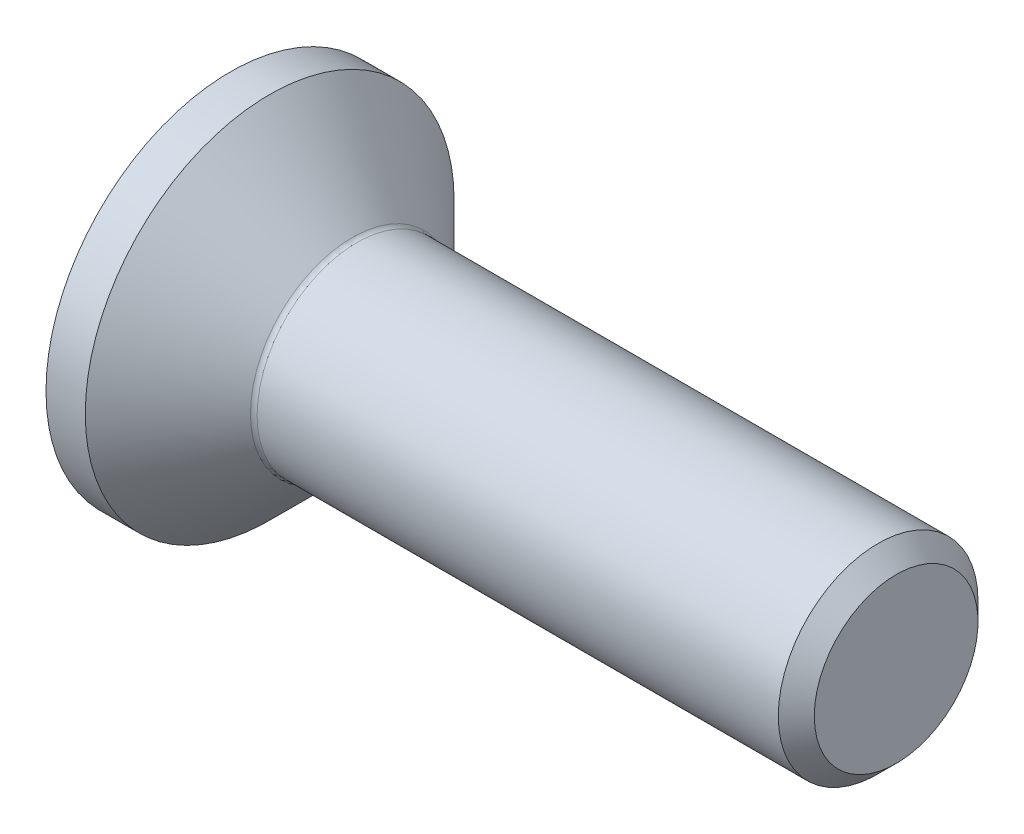
ISO-10303-21;
HEADER;
FILE_DESCRIPTION(('STEP AP214'),'2;1');
FILE_NAME('part.step','',(''),(''),'','','');
FILE_SCHEMA(('AUTOMOTIVE_DESIGN { 1 0 10303 214 1 1 1 1 }'));
ENDSEC;
DATA;
#1=APPLICATION_CONTEXT('core data for automotive mechanical design processes');
#2=APPLICATION_PROTOCOL_DEFINITION('international standard','automotive_design',2000,#1);
#3=PRODUCT_CONTEXT('',#1,'mechanical');
#4=PRODUCT('Part','Part','',(#3));
#5=PRODUCT_RELATED_PRODUCT_CATEGORY('part','',(#4));
#6=PRODUCT_DEFINITION_FORMATION('','',#4);
#7=PRODUCT_DEFINITION_CONTEXT('part definition',#1,'design');
#8=PRODUCT_DEFINITION('design','',#6,#7);
#9=PRODUCT_DEFINITION_SHAPE('','',#8);
#10=(LENGTH_UNIT() NAMED_UNIT(*) SI_UNIT(.MILLI.,.METRE.));
#11=(NAMED_UNIT(*) PLANE_ANGLE_UNIT() SI_UNIT($,.RADIAN.));
#12=(NAMED_UNIT(*) SI_UNIT($,.STERADIAN.) SOLID_ANGLE_UNIT());
#13=UNCERTAINTY_MEASURE_WITH_UNIT(LENGTH_MEASURE(1.E-05),#10,'distance_accuracy_value','');
#14=(GEOMETRIC_REPRESENTATION_CONTEXT(3) GLOBAL_UNCERTAINTY_ASSIGNED_CONTEXT((#13)) GLOBAL_UNIT_ASSIGNED_CONTEXT((#10,
#11,#12)) REPRESENTATION_CONTEXT('',''));
#15=CARTESIAN_POINT('',(0.,0.,0.));
#16=DIRECTION('',(0.,0.,1.));
#17=DIRECTION('',(1.,0.,0.));
#18=AXIS2_PLACEMENT_3D('',#15,#16,#17);
#19=CARTESIAN_POINT('',(10.,1.5,0.));
#20=DIRECTION('',(-1.,0.,0.));
#21=DIRECTION('',(0.,0.,1.));
#22=AXIS2_PLACEMENT_3D('',#19,#20,#21);
#23=PLANE('',#22);
#24=CARTESIAN_POINT('',(10.,0.,0.));
#25=DIRECTION('',(-1.,0.,0.));
#26=DIRECTION('',(0.,0.,1.));
#27=AXIS2_PLACEMENT_3D('',#24,#25,#26);
#28=CIRCLE('',#27,1.22949999999999);
#29=CARTESIAN_POINT('',(10.,0.,1.22949999999999));
#30=VERTEX_POINT('',#29);
#31=EDGE_CURVE('E11',#30,#30,#28,.F.);
#32=ORIENTED_EDGE('',*,*,#31,.T.);
#33=EDGE_LOOP('',(#32));
#34=FACE_BOUND('',#33,.T.);
#35=ADVANCED_FACE('F40',(#34),#23,.F.);
#36=CARTESIAN_POINT('',(-0.587069180985524,0.,0.));
#37=DIRECTION('',(-1.,0.,0.));
#38=DIRECTION('',(0.,0.,1.));
#39=AXIS2_PLACEMENT_3D('',#36,#37,#38);
#40=CYLINDRICAL_SURFACE('',#39,1.5);
#41=CARTESIAN_POINT('',(9.7295,0.,0.));
#42=DIRECTION('',(-1.,0.,0.));
#43=DIRECTION('',(0.,0.,1.));
#44=AXIS2_PLACEMENT_3D('',#41,#42,#43);
#45=CIRCLE('',#44,1.5);
#46=CARTESIAN_POINT('',(9.7295,0.,1.5));
#47=VERTEX_POINT('',#46);
#48=EDGE_CURVE('E49',#47,#47,#45,.T.);
#49=ORIENTED_EDGE('',*,*,#48,.T.);
#50=EDGE_LOOP('',(#49));
#51=FACE_BOUND('',#50,.T.);
#52=CARTESIAN_POINT('',(1.90142135623731,0.,0.));
#53=DIRECTION('',(-1.,0.,0.));
#54=DIRECTION('',(0.,0.,1.));
#55=AXIS2_PLACEMENT_3D('',#52,#53,#54);
#56=CIRCLE('',#55,1.5);
#57=CARTESIAN_POINT('',(1.90142135623731,0.,1.5));
#58=VERTEX_POINT('',#57);
#59=EDGE_CURVE('E153',#58,#58,#56,.F.);
#60=ORIENTED_EDGE('',*,*,#59,.T.);
#61=EDGE_LOOP('',(#60));
#62=FACE_BOUND('',#61,.T.);
#63=ADVANCED_FACE('F131',(#51,#62),#40,.T.);
#64=CARTESIAN_POINT('',(1.86,0.,0.));
#65=DIRECTION('',(-1.,0.,0.));
#66=DIRECTION('',(0.,0.,1.));
#67=AXIS2_PLACEMENT_3D('',#64,#65,#66);
#68=CONICAL_SURFACE('',#67,1.5,0.785398163397448);
#69=CARTESIAN_POINT('',(0.589999999999995,0.,0.));
#70=DIRECTION('',(-1.,0.,0.));
#71=DIRECTION('',(0.,0.,1.));
#72=AXIS2_PLACEMENT_3D('',#69,#70,#71);
#73=CIRCLE('',#72,2.77);
#74=CARTESIAN_POINT('',(0.589999999999995,0.,2.77));
#75=VERTEX_POINT('',#74);
#76=EDGE_CURVE('E44',#75,#75,#73,.F.);
#77=ORIENTED_EDGE('',*,*,#76,.T.);
#78=EDGE_LOOP('',(#77));
#79=FACE_BOUND('',#78,.T.);
#80=CARTESIAN_POINT('',(1.83071067811865,0.,0.));
#81=DIRECTION('',(-1.,0.,0.));
#82=DIRECTION('',(0.,0.,1.));
#83=AXIS2_PLACEMENT_3D('',#80,#81,#82);
#84=CIRCLE('',#83,1.52928932188134);
#85=CARTESIAN_POINT('',(1.83071067811865,0.,1.52928932188134));
#86=VERTEX_POINT('',#85);
#87=EDGE_CURVE('E156',#86,#86,#84,.T.);
#88=ORIENTED_EDGE('',*,*,#87,.T.);
#89=EDGE_LOOP('',(#88));
#90=FACE_BOUND('',#89,.T.);
#91=ADVANCED_FACE('F137',(#79,#90),#68,.T.);
#92=CARTESIAN_POINT('',(1.90142135623731,0.,0.));
#93=DIRECTION('',(-1.,0.,0.));
#94=DIRECTION('',(0.,0.,1.));
#95=AXIS2_PLACEMENT_3D('',#92,#93,#94);
#96=TOROIDAL_SURFACE('',#95,1.6,0.1);
#97=ORIENTED_EDGE('',*,*,#59,.F.);
#98=EDGE_LOOP('',(#97));
#99=FACE_BOUND('',#98,.T.);
#100=ORIENTED_EDGE('',*,*,#87,.F.);
#101=EDGE_LOOP('',(#100));
#102=FACE_BOUND('',#101,.T.);
#103=ADVANCED_FACE('F141',(#99,#102),#96,.F.);
#104=CARTESIAN_POINT('',(9.7295,0.,0.));
#105=DIRECTION('',(-1.,0.,0.));
#106=DIRECTION('',(0.,0.,1.));
#107=AXIS2_PLACEMENT_3D('',#104,#105,#106);
#108=CONICAL_SURFACE('',#107,1.5,0.785398163397456);
#109=ORIENTED_EDGE('',*,*,#31,.F.);
#110=EDGE_LOOP('',(#109));
#111=FACE_BOUND('',#110,.T.);
#112=ORIENTED_EDGE('',*,*,#48,.F.);
#113=EDGE_LOOP('',(#112));
#114=FACE_BOUND('',#113,.T.);
#115=ADVANCED_FACE('F42',(#111,#114),#108,.T.);
#116=CARTESIAN_POINT('',(11.8531386861314,0.,0.));
#117=DIRECTION('',(1.,0.,0.));
#118=DIRECTION('',(0.,0.,-1.));
#119=AXIS2_PLACEMENT_3D('',#116,#117,#118);
#120=CYLINDRICAL_SURFACE('',#119,2.77);
#121=ORIENTED_EDGE('',*,*,#76,.F.);
#122=EDGE_LOOP('',(#121));
#123=FACE_BOUND('',#122,.T.);
#124=CARTESIAN_POINT('',(0.,0.,0.));
#125=DIRECTION('',(1.,0.,0.));
#126=DIRECTION('',(0.,0.,-1.));
#127=AXIS2_PLACEMENT_3D('',#124,#125,#126);
#128=CIRCLE('',#127,2.77);
#129=CARTESIAN_POINT('',(0.,0.,-2.77));
#130=VERTEX_POINT('',#129);
#131=EDGE_CURVE('E223',#130,#130,#128,.F.);
#132=ORIENTED_EDGE('',*,*,#131,.F.);
#133=EDGE_LOOP('',(#132));
#134=FACE_BOUND('',#133,.T.);
#135=ADVANCED_FACE('F118',(#123,#134),#120,.T.);
#136=CARTESIAN_POINT('',(1.67735026918963,0.,0.));
#137=DIRECTION('',(-1.,0.,0.));
#138=DIRECTION('',(0.,0.,1.));
#139=AXIS2_PLACEMENT_3D('',#136,#137,#138);
#140=CONICAL_SURFACE('',#139,0.,1.0471975511966);
#141=CARTESIAN_POINT('',(1.1,0.,0.));
#142=DIRECTION('',(-1.,0.,0.));
#143=DIRECTION('',(0.,0.,1.));
#144=AXIS2_PLACEMENT_3D('',#141,#142,#143);
#145=CIRCLE('',#144,1.);
#146=CARTESIAN_POINT('',(1.1,0.5,0.866025403784439));
#147=VERTEX_POINT('',#146);
#148=CARTESIAN_POINT('',(1.1,1.,0.));
#149=VERTEX_POINT('',#148);
#150=EDGE_CURVE('E163',#147,#149,#145,.T.);
#151=ORIENTED_EDGE('',*,*,#150,.T.);
#152=CARTESIAN_POINT('',(1.1,0.5,-0.866025403784439));
#153=VERTEX_POINT('',#152);
#154=EDGE_CURVE('E158',#149,#153,#145,.T.);
#155=ORIENTED_EDGE('',*,*,#154,.T.);
#156=CARTESIAN_POINT('',(1.1,-0.5,-0.866025403784439));
#157=VERTEX_POINT('',#156);
#158=EDGE_CURVE('E161',#153,#157,#145,.T.);
#159=ORIENTED_EDGE('',*,*,#158,.T.);
#160=CARTESIAN_POINT('',(1.1,-1.,0.));
#161=VERTEX_POINT('',#160);
#162=EDGE_CURVE('E248',#157,#161,#145,.T.);
#163=ORIENTED_EDGE('',*,*,#162,.T.);
#164=CARTESIAN_POINT('',(1.1,-0.5,0.866025403784438));
#165=VERTEX_POINT('',#164);
#166=EDGE_CURVE('E56',#161,#165,#145,.T.);
#167=ORIENTED_EDGE('',*,*,#166,.T.);
#168=EDGE_CURVE('E172',#165,#147,#145,.T.);
#169=ORIENTED_EDGE('',*,*,#168,.T.);
#170=EDGE_LOOP('',(#151,#155,#159,#163,#167,#169));
#171=FACE_BOUND('',#170,.T.);
#172=CARTESIAN_POINT('',(1.67735026918963,0.,0.));
#173=VERTEX_POINT('',#172);
#174=VERTEX_LOOP('',#173);
#175=FACE_BOUND('',#174,.T.);
#176=ADVANCED_FACE('F115',(#171,#175),#140,.F.);
#177=CARTESIAN_POINT('',(1.1,-2.,0.));
#178=DIRECTION('',(-1.,0.,0.));
#179=DIRECTION('',(0.,0.,1.));
#180=AXIS2_PLACEMENT_3D('',#177,#178,#179);
#181=PLANE('',#180);
#182=ORIENTED_EDGE('',*,*,#166,.F.);
#183=DIRECTION('',(0.,0.,-1.));
#184=VECTOR('',#183,1.);
#185=CARTESIAN_POINT('',(1.1,-1.,0.577350269189626));
#186=LINE('',#185,#184);
#187=CARTESIAN_POINT('',(1.1,-1.,0.577350269189626));
#188=VERTEX_POINT('',#187);
#189=EDGE_CURVE('E183',#188,#161,#186,.T.);
#190=ORIENTED_EDGE('',*,*,#189,.F.);
#191=DIRECTION('',(0.,-0.866025403784439,-0.5));
#192=VECTOR('',#191,1.);
#193=CARTESIAN_POINT('',(1.1,0.,1.15470053837925));
#194=LINE('',#193,#192);
#195=EDGE_CURVE('E207',#165,#188,#194,.T.);
#196=ORIENTED_EDGE('',*,*,#195,.F.);
#197=EDGE_LOOP('',(#182,#190,#196));
#198=FACE_BOUND('',#197,.T.);
#199=ADVANCED_FACE('F117',(#198),#181,.T.);
#200=ORIENTED_EDGE('',*,*,#168,.F.);
#201=CARTESIAN_POINT('',(1.1,0.,1.15470053837925));
#202=VERTEX_POINT('',#201);
#203=EDGE_CURVE('E204',#202,#165,#194,.T.);
#204=ORIENTED_EDGE('',*,*,#203,.F.);
#205=DIRECTION('',(0.,-0.866025403784439,0.5));
#206=VECTOR('',#205,1.);
#207=CARTESIAN_POINT('',(1.1,1.,0.577350269189626));
#208=LINE('',#207,#206);
#209=EDGE_CURVE('E211',#147,#202,#208,.T.);
#210=ORIENTED_EDGE('',*,*,#209,.F.);
#211=EDGE_LOOP('',(#200,#204,#210));
#212=FACE_BOUND('',#211,.T.);
#213=ADVANCED_FACE('F124',(#212),#181,.T.);
#214=ORIENTED_EDGE('',*,*,#150,.F.);
#215=CARTESIAN_POINT('',(1.1,1.,0.577350269189626));
#216=VERTEX_POINT('',#215);
#217=EDGE_CURVE('E208',#216,#147,#208,.T.);
#218=ORIENTED_EDGE('',*,*,#217,.F.);
#219=DIRECTION('',(0.,0.,1.));
#220=VECTOR('',#219,1.);
#221=CARTESIAN_POINT('',(1.1,1.,-0.577350269189626));
#222=LINE('',#221,#220);
#223=EDGE_CURVE('E215',#149,#216,#222,.T.);
#224=ORIENTED_EDGE('',*,*,#223,.F.);
#225=EDGE_LOOP('',(#214,#218,#224));
#226=FACE_BOUND('',#225,.T.);
#227=ADVANCED_FACE('F279',(#226),#181,.T.);
#228=ORIENTED_EDGE('',*,*,#154,.F.);
#229=CARTESIAN_POINT('',(1.1,1.,-0.577350269189626));
#230=VERTEX_POINT('',#229);
#231=EDGE_CURVE('E212',#230,#149,#222,.T.);
#232=ORIENTED_EDGE('',*,*,#231,.F.);
#233=DIRECTION('',(0.,0.866025403784439,0.5));
#234=VECTOR('',#233,1.);
#235=CARTESIAN_POINT('',(1.1,0.,-1.15470053837925));
#236=LINE('',#235,#234);
#237=EDGE_CURVE('E219',#153,#230,#236,.T.);
#238=ORIENTED_EDGE('',*,*,#237,.F.);
#239=EDGE_LOOP('',(#228,#232,#238));
#240=FACE_BOUND('',#239,.T.);
#241=ADVANCED_FACE('F284',(#240),#181,.T.);
#242=ORIENTED_EDGE('',*,*,#158,.F.);
#243=CARTESIAN_POINT('',(1.1,0.,-1.15470053837925));
#244=VERTEX_POINT('',#243);
#245=EDGE_CURVE('E216',#244,#153,#236,.T.);
#246=ORIENTED_EDGE('',*,*,#245,.F.);
#247=DIRECTION('',(0.,0.866025403784439,-0.5));
#248=VECTOR('',#247,1.);
#249=CARTESIAN_POINT('',(1.1,-0.999999999999999,-0.577350269189627));
#250=LINE('',#249,#248);
#251=EDGE_CURVE('E187',#157,#244,#250,.T.);
#252=ORIENTED_EDGE('',*,*,#251,.F.);
#253=EDGE_LOOP('',(#242,#246,#252));
#254=FACE_BOUND('',#253,.T.);
#255=ADVANCED_FACE('F253',(#254),#181,.T.);
#256=ORIENTED_EDGE('',*,*,#162,.F.);
#257=CARTESIAN_POINT('',(1.1,-0.999999999999999,-0.577350269189627));
#258=VERTEX_POINT('',#257);
#259=EDGE_CURVE('E220',#258,#157,#250,.T.);
#260=ORIENTED_EDGE('',*,*,#259,.F.);
#261=EDGE_CURVE('E203',#161,#258,#186,.T.);
#262=ORIENTED_EDGE('',*,*,#261,.F.);
#263=EDGE_LOOP('',(#256,#260,#262));
#264=FACE_BOUND('',#263,.T.);
#265=ADVANCED_FACE('F127',(#264),#181,.T.);
#266=CARTESIAN_POINT('',(1.1,-1.,0.577350269189626));
#267=DIRECTION('',(0.,1.,0.));
#268=DIRECTION('',(0.,0.,1.));
#269=AXIS2_PLACEMENT_3D('',#266,#267,#268);
#270=PLANE('',#269);
#271=DIRECTION('',(0.,0.,-1.));
#272=VECTOR('',#271,1.);
#273=CARTESIAN_POINT('',(0.,-1.,0.577350269189626));
#274=LINE('',#273,#272);
#275=CARTESIAN_POINT('',(0.,-1.,0.577350269189626));
#276=VERTEX_POINT('',#275);
#277=CARTESIAN_POINT('',(0.,-0.999999999999999,-0.577350269189627));
#278=VERTEX_POINT('',#277);
#279=EDGE_CURVE('E184',#276,#278,#274,.T.);
#280=ORIENTED_EDGE('',*,*,#279,.F.);
#281=DIRECTION('',(-1.,0.,0.));
#282=VECTOR('',#281,1.);
#283=CARTESIAN_POINT('',(1.1,-1.,0.577350269189626));
#284=LINE('',#283,#282);
#285=EDGE_CURVE('E179',#188,#276,#284,.T.);
#286=ORIENTED_EDGE('',*,*,#285,.F.);
#287=ORIENTED_EDGE('',*,*,#189,.T.);
#288=ORIENTED_EDGE('',*,*,#261,.T.);
#289=DIRECTION('',(-1.,0.,0.));
#290=VECTOR('',#289,1.);
#291=CARTESIAN_POINT('',(1.1,-0.999999999999999,-0.577350269189627));
#292=LINE('',#291,#290);
#293=EDGE_CURVE('E181',#258,#278,#292,.T.);
#294=ORIENTED_EDGE('',*,*,#293,.T.);
#295=EDGE_LOOP('',(#280,#286,#287,#288,#294));
#296=FACE_BOUND('',#295,.T.);
#297=ADVANCED_FACE('F242',(#296),#270,.T.);
#298=CARTESIAN_POINT('',(1.1,0.,1.15470053837925));
#299=DIRECTION('',(0.,0.5,-0.866025403784438));
#300=DIRECTION('',(0.,0.866025403784439,0.5));
#301=AXIS2_PLACEMENT_3D('',#298,#299,#300);
#302=PLANE('',#301);
#303=DIRECTION('',(0.,-0.866025403784439,-0.5));
#304=VECTOR('',#303,1.);
#305=CARTESIAN_POINT('',(0.,0.,1.15470053837925));
#306=LINE('',#305,#304);
#307=CARTESIAN_POINT('',(0.,0.,1.15470053837925));
#308=VERTEX_POINT('',#307);
#309=EDGE_CURVE('E188',#308,#276,#306,.T.);
#310=ORIENTED_EDGE('',*,*,#309,.F.);
#311=DIRECTION('',(-1.,0.,0.));
#312=VECTOR('',#311,1.);
#313=CARTESIAN_POINT('',(1.1,0.,1.15470053837925));
#314=LINE('',#313,#312);
#315=EDGE_CURVE('E177',#202,#308,#314,.T.);
#316=ORIENTED_EDGE('',*,*,#315,.F.);
#317=ORIENTED_EDGE('',*,*,#203,.T.);
#318=ORIENTED_EDGE('',*,*,#195,.T.);
#319=ORIENTED_EDGE('',*,*,#285,.T.);
#320=EDGE_LOOP('',(#310,#316,#317,#318,#319));
#321=FACE_BOUND('',#320,.T.);
#322=ADVANCED_FACE('F272',(#321),#302,.T.);
#323=CARTESIAN_POINT('',(1.1,1.,0.577350269189626));
#324=DIRECTION('',(0.,-0.5,-0.866025403784439));
#325=DIRECTION('',(0.,0.866025403784439,-0.5));
#326=AXIS2_PLACEMENT_3D('',#323,#324,#325);
#327=PLANE('',#326);
#328=DIRECTION('',(0.,-0.866025403784439,0.5));
#329=VECTOR('',#328,1.);
#330=CARTESIAN_POINT('',(0.,1.,0.577350269189626));
#331=LINE('',#330,#329);
#332=CARTESIAN_POINT('',(0.,1.,0.577350269189626));
#333=VERTEX_POINT('',#332);
#334=EDGE_CURVE('E191',#333,#308,#331,.T.);
#335=ORIENTED_EDGE('',*,*,#334,.F.);
#336=DIRECTION('',(-1.,0.,0.));
#337=VECTOR('',#336,1.);
#338=CARTESIAN_POINT('',(1.1,1.,0.577350269189626));
#339=LINE('',#338,#337);
#340=EDGE_CURVE('E175',#216,#333,#339,.T.);
#341=ORIENTED_EDGE('',*,*,#340,.F.);
#342=ORIENTED_EDGE('',*,*,#217,.T.);
#343=ORIENTED_EDGE('',*,*,#209,.T.);
#344=ORIENTED_EDGE('',*,*,#315,.T.);
#345=EDGE_LOOP('',(#335,#341,#342,#343,#344));
#346=FACE_BOUND('',#345,.T.);
#347=ADVANCED_FACE('F266',(#346),#327,.T.);
#348=CARTESIAN_POINT('',(1.1,1.,-0.577350269189626));
#349=DIRECTION('',(0.,-1.,0.));
#350=DIRECTION('',(0.,0.,-1.));
#351=AXIS2_PLACEMENT_3D('',#348,#349,#350);
#352=PLANE('',#351);
#353=DIRECTION('',(0.,0.,1.));
#354=VECTOR('',#353,1.);
#355=CARTESIAN_POINT('',(0.,1.,-0.577350269189626));
#356=LINE('',#355,#354);
#357=CARTESIAN_POINT('',(0.,1.,-0.577350269189626));
#358=VERTEX_POINT('',#357);
#359=EDGE_CURVE('E194',#358,#333,#356,.T.);
#360=ORIENTED_EDGE('',*,*,#359,.F.);
#361=DIRECTION('',(-1.,0.,0.));
#362=VECTOR('',#361,1.);
#363=CARTESIAN_POINT('',(1.1,1.,-0.577350269189626));
#364=LINE('',#363,#362);
#365=EDGE_CURVE('E173',#230,#358,#364,.T.);
#366=ORIENTED_EDGE('',*,*,#365,.F.);
#367=ORIENTED_EDGE('',*,*,#231,.T.);
#368=ORIENTED_EDGE('',*,*,#223,.T.);
#369=ORIENTED_EDGE('',*,*,#340,.T.);
#370=EDGE_LOOP('',(#360,#366,#367,#368,#369));
#371=FACE_BOUND('',#370,.T.);
#372=ADVANCED_FACE('F262',(#371),#352,.T.);
#373=CARTESIAN_POINT('',(1.1,0.,-1.15470053837925));
#374=DIRECTION('',(0.,-0.5,0.866025403784438));
#375=DIRECTION('',(0.,-0.866025403784439,-0.5));
#376=AXIS2_PLACEMENT_3D('',#373,#374,#375);
#377=PLANE('',#376);
#378=DIRECTION('',(0.,0.866025403784439,0.5));
#379=VECTOR('',#378,1.);
#380=CARTESIAN_POINT('',(0.,0.,-1.15470053837925));
#381=LINE('',#380,#379);
#382=CARTESIAN_POINT('',(0.,0.,-1.15470053837925));
#383=VERTEX_POINT('',#382);
#384=EDGE_CURVE('E197',#383,#358,#381,.T.);
#385=ORIENTED_EDGE('',*,*,#384,.F.);
#386=DIRECTION('',(-1.,0.,0.));
#387=VECTOR('',#386,1.);
#388=CARTESIAN_POINT('',(1.1,0.,-1.15470053837925));
#389=LINE('',#388,#387);
#390=EDGE_CURVE('E165',#244,#383,#389,.T.);
#391=ORIENTED_EDGE('',*,*,#390,.F.);
#392=ORIENTED_EDGE('',*,*,#245,.T.);
#393=ORIENTED_EDGE('',*,*,#237,.T.);
#394=ORIENTED_EDGE('',*,*,#365,.T.);
#395=EDGE_LOOP('',(#385,#391,#392,#393,#394));
#396=FACE_BOUND('',#395,.T.);
#397=ADVANCED_FACE('F257',(#396),#377,.T.);
#398=CARTESIAN_POINT('',(1.1,-0.999999999999999,-0.577350269189627));
#399=DIRECTION('',(0.,0.5,0.866025403784439));
#400=DIRECTION('',(0.,-0.866025403784439,0.5));
#401=AXIS2_PLACEMENT_3D('',#398,#399,#400);
#402=PLANE('',#401);
#403=DIRECTION('',(0.,0.866025403784439,-0.5));
#404=VECTOR('',#403,1.);
#405=CARTESIAN_POINT('',(0.,-0.999999999999999,-0.577350269189627));
#406=LINE('',#405,#404);
#407=EDGE_CURVE('E64',#278,#383,#406,.T.);
#408=ORIENTED_EDGE('',*,*,#407,.F.);
#409=ORIENTED_EDGE('',*,*,#293,.F.);
#410=ORIENTED_EDGE('',*,*,#259,.T.);
#411=ORIENTED_EDGE('',*,*,#251,.T.);
#412=ORIENTED_EDGE('',*,*,#390,.T.);
#413=EDGE_LOOP('',(#408,#409,#410,#411,#412));
#414=FACE_BOUND('',#413,.T.);
#415=ADVANCED_FACE('F236',(#414),#402,.T.);
#416=CARTESIAN_POINT('',(0.,0.,0.));
#417=DIRECTION('',(1.,0.,0.));
#418=DIRECTION('',(0.,0.,-1.));
#419=AXIS2_PLACEMENT_3D('',#416,#417,#418);
#420=PLANE('',#419);
#421=ORIENTED_EDGE('',*,*,#131,.T.);
#422=EDGE_LOOP('',(#421));
#423=FACE_BOUND('',#422,.T.);
#424=ORIENTED_EDGE('',*,*,#407,.T.);
#425=ORIENTED_EDGE('',*,*,#384,.T.);
#426=ORIENTED_EDGE('',*,*,#359,.T.);
#427=ORIENTED_EDGE('',*,*,#334,.T.);
#428=ORIENTED_EDGE('',*,*,#309,.T.);
#429=ORIENTED_EDGE('',*,*,#279,.T.);
#430=EDGE_LOOP('',(#424,#425,#426,#427,#428,#429));
#431=FACE_BOUND('',#430,.T.);
#432=ADVANCED_FACE('F233',(#423,#431),#420,.F.);
#433=CLOSED_SHELL('',(#35,#63,#91,#103,#115,#135,#176,#199,#213,#227,#241,#255,#265,#297,#322,
#347,#372,#397,#415,#432));
#434=MANIFOLD_SOLID_BREP('B2',#433);
#435=ADVANCED_BREP_SHAPE_REPRESENTATION('',(#18,#434),#14);
#436=SHAPE_DEFINITION_REPRESENTATION(#9,#435);
ENDSEC;
END-ISO-10303-21;
